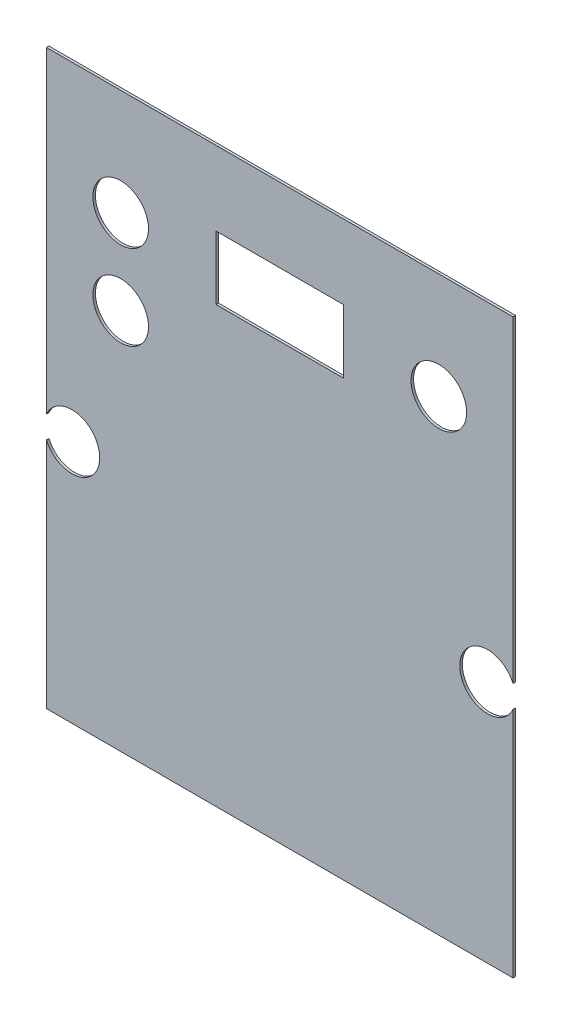
ISO-10303-21;
HEADER;
FILE_DESCRIPTION(('STEP AP214'),'2;1');
FILE_NAME('part.step','',(''),(''),'','','');
FILE_SCHEMA(('AUTOMOTIVE_DESIGN { 1 0 10303 214 1 1 1 1 }'));
ENDSEC;
DATA;
#1=APPLICATION_CONTEXT('core data for automotive mechanical design processes');
#2=APPLICATION_PROTOCOL_DEFINITION('international standard','automotive_design',2000,#1);
#3=PRODUCT_CONTEXT('',#1,'mechanical');
#4=PRODUCT('Part','Part','',(#3));
#5=PRODUCT_RELATED_PRODUCT_CATEGORY('part','',(#4));
#6=PRODUCT_DEFINITION_FORMATION('','',#4);
#7=PRODUCT_DEFINITION_CONTEXT('part definition',#1,'design');
#8=PRODUCT_DEFINITION('design','',#6,#7);
#9=PRODUCT_DEFINITION_SHAPE('','',#8);
#10=(LENGTH_UNIT() NAMED_UNIT(*) SI_UNIT(.MILLI.,.METRE.));
#11=(NAMED_UNIT(*) PLANE_ANGLE_UNIT() SI_UNIT($,.RADIAN.));
#12=(NAMED_UNIT(*) SI_UNIT($,.STERADIAN.) SOLID_ANGLE_UNIT());
#13=UNCERTAINTY_MEASURE_WITH_UNIT(LENGTH_MEASURE(1.E-05),#10,'distance_accuracy_value','');
#14=(GEOMETRIC_REPRESENTATION_CONTEXT(3) GLOBAL_UNCERTAINTY_ASSIGNED_CONTEXT((#13)) GLOBAL_UNIT_ASSIGNED_CONTEXT((#10,
#11,#12)) REPRESENTATION_CONTEXT('',''));
#15=CARTESIAN_POINT('',(0.,0.,0.));
#16=DIRECTION('',(0.,0.,1.));
#17=DIRECTION('',(1.,0.,0.));
#18=AXIS2_PLACEMENT_3D('',#15,#16,#17);
#19=CARTESIAN_POINT('',(26.416,14.605,0.15));
#20=DIRECTION('',(0.,0.,1.));
#21=DIRECTION('',(1.,0.,0.));
#22=AXIS2_PLACEMENT_3D('',#19,#20,#21);
#23=PLANE('',#22);
#24=CARTESIAN_POINT('',(4.445,27.94,0.15));
#25=DIRECTION('',(0.,0.,1.));
#26=DIRECTION('',(1.,0.,0.));
#27=AXIS2_PLACEMENT_3D('',#24,#25,#26);
#28=CIRCLE('',#27,1.6637);
#29=CARTESIAN_POINT('',(6.1087,27.94,0.15));
#30=VERTEX_POINT('',#29);
#31=EDGE_CURVE('E164',#30,#30,#28,.T.);
#32=ORIENTED_EDGE('',*,*,#31,.F.);
#33=EDGE_LOOP('',(#32));
#34=FACE_BOUND('',#33,.T.);
#35=DIRECTION('',(0.,-1.,0.));
#36=VECTOR('',#35,1.);
#37=CARTESIAN_POINT('',(0.,13.9376757235047,0.15));
#38=LINE('',#37,#36);
#39=CARTESIAN_POINT('',(0.,13.9376757235047,0.15));
#40=VERTEX_POINT('',#39);
#41=CARTESIAN_POINT('',(0.,0.,0.15));
#42=VERTEX_POINT('',#41);
#43=EDGE_CURVE('E176',#40,#42,#38,.T.);
#44=ORIENTED_EDGE('',*,*,#43,.T.);
#45=DIRECTION('',(1.,0.,0.));
#46=VECTOR('',#45,1.);
#47=CARTESIAN_POINT('',(0.,0.,0.15));
#48=LINE('',#47,#46);
#49=CARTESIAN_POINT('',(27.94,0.,0.15));
#50=VERTEX_POINT('',#49);
#51=EDGE_CURVE('E179',#42,#50,#48,.T.);
#52=ORIENTED_EDGE('',*,*,#51,.T.);
#53=DIRECTION('',(0.,1.,0.));
#54=VECTOR('',#53,1.);
#55=CARTESIAN_POINT('',(27.94,0.,0.15));
#56=LINE('',#55,#54);
#57=CARTESIAN_POINT('',(27.94,13.9376757235047,0.15));
#58=VERTEX_POINT('',#57);
#59=EDGE_CURVE('E182',#50,#58,#56,.T.);
#60=ORIENTED_EDGE('',*,*,#59,.T.);
#61=CARTESIAN_POINT('',(26.416,14.605,0.15));
#62=DIRECTION('',(0.,0.,-1.));
#63=DIRECTION('',(1.,0.,0.));
#64=AXIS2_PLACEMENT_3D('',#61,#62,#63);
#65=CIRCLE('',#64,1.6637);
#66=CARTESIAN_POINT('',(27.94,15.2723242764953,0.15));
#67=VERTEX_POINT('',#66);
#68=EDGE_CURVE('E184',#58,#67,#65,.T.);
#69=ORIENTED_EDGE('',*,*,#68,.T.);
#70=DIRECTION('',(0.,1.,0.));
#71=VECTOR('',#70,1.);
#72=CARTESIAN_POINT('',(27.94,15.2723242764953,0.15));
#73=LINE('',#72,#71);
#74=CARTESIAN_POINT('',(27.94,34.29,0.15));
#75=VERTEX_POINT('',#74);
#76=EDGE_CURVE('E186',#67,#75,#73,.T.);
#77=ORIENTED_EDGE('',*,*,#76,.T.);
#78=DIRECTION('',(-1.,0.,0.));
#79=VECTOR('',#78,1.);
#80=CARTESIAN_POINT('',(27.94,34.29,0.15));
#81=LINE('',#80,#79);
#82=CARTESIAN_POINT('',(0.,34.29,0.15));
#83=VERTEX_POINT('',#82);
#84=EDGE_CURVE('E188',#75,#83,#81,.T.);
#85=ORIENTED_EDGE('',*,*,#84,.T.);
#86=DIRECTION('',(0.,-1.,0.));
#87=VECTOR('',#86,1.);
#88=CARTESIAN_POINT('',(0.,34.29,0.15));
#89=LINE('',#88,#87);
#90=CARTESIAN_POINT('',(0.,15.2723242764953,0.15));
#91=VERTEX_POINT('',#90);
#92=EDGE_CURVE('E190',#83,#91,#89,.T.);
#93=ORIENTED_EDGE('',*,*,#92,.T.);
#94=CARTESIAN_POINT('',(1.524,14.605,0.15));
#95=DIRECTION('',(0.,0.,-1.));
#96=DIRECTION('',(1.,0.,0.));
#97=AXIS2_PLACEMENT_3D('',#94,#95,#96);
#98=CIRCLE('',#97,1.6637);
#99=EDGE_CURVE('E192',#91,#40,#98,.T.);
#100=ORIENTED_EDGE('',*,*,#99,.T.);
#101=EDGE_LOOP('',(#44,#52,#60,#69,#77,#85,#93,#100));
#102=FACE_BOUND('',#101,.T.);
#103=CARTESIAN_POINT('',(4.445,22.86,0.15));
#104=DIRECTION('',(0.,0.,1.));
#105=DIRECTION('',(1.,0.,0.));
#106=AXIS2_PLACEMENT_3D('',#103,#104,#105);
#107=CIRCLE('',#106,1.6637);
#108=CARTESIAN_POINT('',(6.1087,22.86,0.15));
#109=VERTEX_POINT('',#108);
#110=EDGE_CURVE('E170',#109,#109,#107,.T.);
#111=ORIENTED_EDGE('',*,*,#110,.F.);
#112=EDGE_LOOP('',(#111));
#113=FACE_BOUND('',#112,.T.);
#114=CARTESIAN_POINT('',(23.495,27.94,0.15));
#115=DIRECTION('',(0.,0.,1.));
#116=DIRECTION('',(1.,0.,0.));
#117=AXIS2_PLACEMENT_3D('',#114,#115,#116);
#118=CIRCLE('',#117,1.6637);
#119=CARTESIAN_POINT('',(25.1587,27.94,0.15));
#120=VERTEX_POINT('',#119);
#121=EDGE_CURVE('E158',#120,#120,#118,.T.);
#122=ORIENTED_EDGE('',*,*,#121,.F.);
#123=EDGE_LOOP('',(#122));
#124=FACE_BOUND('',#123,.T.);
#125=DIRECTION('',(-1.,0.,0.));
#126=VECTOR('',#125,1.);
#127=CARTESIAN_POINT('',(10.16,29.845,0.15));
#128=LINE('',#127,#126);
#129=CARTESIAN_POINT('',(17.78,29.845,0.15));
#130=VERTEX_POINT('',#129);
#131=CARTESIAN_POINT('',(10.16,29.845,0.15));
#132=VERTEX_POINT('',#131);
#133=EDGE_CURVE('E130',#130,#132,#128,.T.);
#134=ORIENTED_EDGE('',*,*,#133,.F.);
#135=DIRECTION('',(0.,1.,0.));
#136=VECTOR('',#135,1.);
#137=CARTESIAN_POINT('',(17.78,26.035,0.15));
#138=LINE('',#137,#136);
#139=CARTESIAN_POINT('',(17.78,26.035,0.15));
#140=VERTEX_POINT('',#139);
#141=EDGE_CURVE('E122',#140,#130,#138,.T.);
#142=ORIENTED_EDGE('',*,*,#141,.F.);
#143=DIRECTION('',(1.,0.,0.));
#144=VECTOR('',#143,1.);
#145=CARTESIAN_POINT('',(10.16,26.035,0.15));
#146=LINE('',#145,#144);
#147=CARTESIAN_POINT('',(10.16,26.035,0.15));
#148=VERTEX_POINT('',#147);
#149=EDGE_CURVE('E144',#148,#140,#146,.T.);
#150=ORIENTED_EDGE('',*,*,#149,.F.);
#151=DIRECTION('',(0.,-1.,0.));
#152=VECTOR('',#151,1.);
#153=CARTESIAN_POINT('',(10.16,26.035,0.15));
#154=LINE('',#153,#152);
#155=EDGE_CURVE('E142',#132,#148,#154,.T.);
#156=ORIENTED_EDGE('',*,*,#155,.F.);
#157=EDGE_LOOP('',(#134,#142,#150,#156));
#158=FACE_BOUND('',#157,.T.);
#159=ADVANCED_FACE('F33',(#34,#102,#113,#124,#158),#23,.T.);
#160=CARTESIAN_POINT('',(26.416,14.605,0.));
#161=DIRECTION('',(0.,0.,1.));
#162=DIRECTION('',(1.,0.,0.));
#163=AXIS2_PLACEMENT_3D('',#160,#161,#162);
#164=PLANE('',#163);
#165=CARTESIAN_POINT('',(23.495,27.94,0.));
#166=DIRECTION('',(0.,0.,1.));
#167=DIRECTION('',(1.,0.,0.));
#168=AXIS2_PLACEMENT_3D('',#165,#166,#167);
#169=CIRCLE('',#168,1.6637);
#170=CARTESIAN_POINT('',(25.1587,27.94,0.));
#171=VERTEX_POINT('',#170);
#172=EDGE_CURVE('E138',#171,#171,#169,.T.);
#173=ORIENTED_EDGE('',*,*,#172,.T.);
#174=EDGE_LOOP('',(#173));
#175=FACE_BOUND('',#174,.T.);
#176=CARTESIAN_POINT('',(4.445,27.94,0.));
#177=DIRECTION('',(0.,0.,1.));
#178=DIRECTION('',(1.,0.,0.));
#179=AXIS2_PLACEMENT_3D('',#176,#177,#178);
#180=CIRCLE('',#179,1.6637);
#181=CARTESIAN_POINT('',(6.1087,27.94,0.));
#182=VERTEX_POINT('',#181);
#183=EDGE_CURVE('E161',#182,#182,#180,.T.);
#184=ORIENTED_EDGE('',*,*,#183,.T.);
#185=EDGE_LOOP('',(#184));
#186=FACE_BOUND('',#185,.T.);
#187=CARTESIAN_POINT('',(4.445,22.86,0.));
#188=DIRECTION('',(0.,0.,1.));
#189=DIRECTION('',(1.,0.,0.));
#190=AXIS2_PLACEMENT_3D('',#187,#188,#189);
#191=CIRCLE('',#190,1.6637);
#192=CARTESIAN_POINT('',(6.1087,22.86,0.));
#193=VERTEX_POINT('',#192);
#194=EDGE_CURVE('E167',#193,#193,#191,.T.);
#195=ORIENTED_EDGE('',*,*,#194,.T.);
#196=EDGE_LOOP('',(#195));
#197=FACE_BOUND('',#196,.T.);
#198=DIRECTION('',(0.,-1.,0.));
#199=VECTOR('',#198,1.);
#200=CARTESIAN_POINT('',(0.,13.9376757235047,0.));
#201=LINE('',#200,#199);
#202=CARTESIAN_POINT('',(0.,13.9376757235047,0.));
#203=VERTEX_POINT('',#202);
#204=CARTESIAN_POINT('',(0.,0.,0.));
#205=VERTEX_POINT('',#204);
#206=EDGE_CURVE('E173',#203,#205,#201,.T.);
#207=ORIENTED_EDGE('',*,*,#206,.F.);
#208=CARTESIAN_POINT('',(1.524,14.605,0.));
#209=DIRECTION('',(0.,0.,-1.));
#210=DIRECTION('',(1.,0.,0.));
#211=AXIS2_PLACEMENT_3D('',#208,#209,#210);
#212=CIRCLE('',#211,1.6637);
#213=CARTESIAN_POINT('',(0.,15.2723242764953,0.));
#214=VERTEX_POINT('',#213);
#215=EDGE_CURVE('E180',#214,#203,#212,.T.);
#216=ORIENTED_EDGE('',*,*,#215,.F.);
#217=DIRECTION('',(0.,-1.,0.));
#218=VECTOR('',#217,1.);
#219=CARTESIAN_POINT('',(0.,34.29,0.));
#220=LINE('',#219,#218);
#221=CARTESIAN_POINT('',(0.,34.29,0.));
#222=VERTEX_POINT('',#221);
#223=EDGE_CURVE('E207',#222,#214,#220,.T.);
#224=ORIENTED_EDGE('',*,*,#223,.F.);
#225=DIRECTION('',(-1.,0.,0.));
#226=VECTOR('',#225,1.);
#227=CARTESIAN_POINT('',(27.94,34.29,0.));
#228=LINE('',#227,#226);
#229=CARTESIAN_POINT('',(27.94,34.29,0.));
#230=VERTEX_POINT('',#229);
#231=EDGE_CURVE('E205',#230,#222,#228,.T.);
#232=ORIENTED_EDGE('',*,*,#231,.F.);
#233=DIRECTION('',(0.,1.,0.));
#234=VECTOR('',#233,1.);
#235=CARTESIAN_POINT('',(27.94,15.2723242764953,0.));
#236=LINE('',#235,#234);
#237=CARTESIAN_POINT('',(27.94,15.2723242764953,0.));
#238=VERTEX_POINT('',#237);
#239=EDGE_CURVE('E203',#238,#230,#236,.T.);
#240=ORIENTED_EDGE('',*,*,#239,.F.);
#241=CARTESIAN_POINT('',(26.416,14.605,0.));
#242=DIRECTION('',(0.,0.,-1.));
#243=DIRECTION('',(1.,0.,0.));
#244=AXIS2_PLACEMENT_3D('',#241,#242,#243);
#245=CIRCLE('',#244,1.6637);
#246=CARTESIAN_POINT('',(27.94,13.9376757235047,0.));
#247=VERTEX_POINT('',#246);
#248=EDGE_CURVE('E201',#247,#238,#245,.T.);
#249=ORIENTED_EDGE('',*,*,#248,.F.);
#250=DIRECTION('',(0.,1.,0.));
#251=VECTOR('',#250,1.);
#252=CARTESIAN_POINT('',(27.94,0.,0.));
#253=LINE('',#252,#251);
#254=CARTESIAN_POINT('',(27.94,0.,0.));
#255=VERTEX_POINT('',#254);
#256=EDGE_CURVE('E199',#255,#247,#253,.T.);
#257=ORIENTED_EDGE('',*,*,#256,.F.);
#258=DIRECTION('',(1.,0.,0.));
#259=VECTOR('',#258,1.);
#260=CARTESIAN_POINT('',(0.,0.,0.));
#261=LINE('',#260,#259);
#262=EDGE_CURVE('E197',#205,#255,#261,.T.);
#263=ORIENTED_EDGE('',*,*,#262,.F.);
#264=EDGE_LOOP('',(#207,#216,#224,#232,#240,#249,#257,#263));
#265=FACE_BOUND('',#264,.T.);
#266=DIRECTION('',(0.,1.,0.));
#267=VECTOR('',#266,1.);
#268=CARTESIAN_POINT('',(17.78,26.035,0.));
#269=LINE('',#268,#267);
#270=CARTESIAN_POINT('',(17.78,26.035,0.));
#271=VERTEX_POINT('',#270);
#272=CARTESIAN_POINT('',(17.78,29.845,0.));
#273=VERTEX_POINT('',#272);
#274=EDGE_CURVE('E56',#271,#273,#269,.T.);
#275=ORIENTED_EDGE('',*,*,#274,.T.);
#276=DIRECTION('',(-1.,0.,0.));
#277=VECTOR('',#276,1.);
#278=CARTESIAN_POINT('',(10.16,29.845,0.));
#279=LINE('',#278,#277);
#280=CARTESIAN_POINT('',(10.16,29.845,0.));
#281=VERTEX_POINT('',#280);
#282=EDGE_CURVE('E137',#273,#281,#279,.T.);
#283=ORIENTED_EDGE('',*,*,#282,.T.);
#284=DIRECTION('',(0.,-1.,0.));
#285=VECTOR('',#284,1.);
#286=CARTESIAN_POINT('',(10.16,26.035,0.));
#287=LINE('',#286,#285);
#288=CARTESIAN_POINT('',(10.16,26.035,0.));
#289=VERTEX_POINT('',#288);
#290=EDGE_CURVE('E150',#281,#289,#287,.T.);
#291=ORIENTED_EDGE('',*,*,#290,.T.);
#292=DIRECTION('',(1.,0.,0.));
#293=VECTOR('',#292,1.);
#294=CARTESIAN_POINT('',(10.16,26.035,0.));
#295=LINE('',#294,#293);
#296=EDGE_CURVE('E131',#289,#271,#295,.T.);
#297=ORIENTED_EDGE('',*,*,#296,.T.);
#298=EDGE_LOOP('',(#275,#283,#291,#297));
#299=FACE_BOUND('',#298,.T.);
#300=ADVANCED_FACE('F237',(#175,#186,#197,#265,#299),#164,.F.);
#301=CARTESIAN_POINT('',(0.,13.9376757235047,0.15));
#302=DIRECTION('',(1.,0.,0.));
#303=DIRECTION('',(0.,0.,-1.));
#304=AXIS2_PLACEMENT_3D('',#301,#302,#303);
#305=PLANE('',#304);
#306=ORIENTED_EDGE('',*,*,#206,.T.);
#307=DIRECTION('',(0.,0.,-1.));
#308=VECTOR('',#307,1.);
#309=CARTESIAN_POINT('',(0.,0.,0.15));
#310=LINE('',#309,#308);
#311=EDGE_CURVE('E11',#42,#205,#310,.T.);
#312=ORIENTED_EDGE('',*,*,#311,.F.);
#313=ORIENTED_EDGE('',*,*,#43,.F.);
#314=DIRECTION('',(0.,0.,-1.));
#315=VECTOR('',#314,1.);
#316=CARTESIAN_POINT('',(0.,13.9376757235047,0.15));
#317=LINE('',#316,#315);
#318=EDGE_CURVE('E194',#40,#203,#317,.T.);
#319=ORIENTED_EDGE('',*,*,#318,.T.);
#320=EDGE_LOOP('',(#306,#312,#313,#319));
#321=FACE_BOUND('',#320,.T.);
#322=ADVANCED_FACE('F35',(#321),#305,.F.);
#323=CARTESIAN_POINT('',(0.,0.,0.15));
#324=DIRECTION('',(0.,1.,0.));
#325=DIRECTION('',(-1.,0.,0.));
#326=AXIS2_PLACEMENT_3D('',#323,#324,#325);
#327=PLANE('',#326);
#328=ORIENTED_EDGE('',*,*,#262,.T.);
#329=DIRECTION('',(0.,0.,-1.));
#330=VECTOR('',#329,1.);
#331=CARTESIAN_POINT('',(27.94,0.,0.15));
#332=LINE('',#331,#330);
#333=EDGE_CURVE('E41',#50,#255,#332,.T.);
#334=ORIENTED_EDGE('',*,*,#333,.F.);
#335=ORIENTED_EDGE('',*,*,#51,.F.);
#336=ORIENTED_EDGE('',*,*,#311,.T.);
#337=EDGE_LOOP('',(#328,#334,#335,#336));
#338=FACE_BOUND('',#337,.T.);
#339=ADVANCED_FACE('F255',(#338),#327,.F.);
#340=CARTESIAN_POINT('',(27.94,0.,0.15));
#341=DIRECTION('',(-1.,0.,0.));
#342=DIRECTION('',(0.,0.,1.));
#343=AXIS2_PLACEMENT_3D('',#340,#341,#342);
#344=PLANE('',#343);
#345=ORIENTED_EDGE('',*,*,#256,.T.);
#346=DIRECTION('',(0.,0.,-1.));
#347=VECTOR('',#346,1.);
#348=CARTESIAN_POINT('',(27.94,13.9376757235047,0.15));
#349=LINE('',#348,#347);
#350=EDGE_CURVE('E224',#58,#247,#349,.T.);
#351=ORIENTED_EDGE('',*,*,#350,.F.);
#352=ORIENTED_EDGE('',*,*,#59,.F.);
#353=ORIENTED_EDGE('',*,*,#333,.T.);
#354=EDGE_LOOP('',(#345,#351,#352,#353));
#355=FACE_BOUND('',#354,.T.);
#356=ADVANCED_FACE('F231',(#355),#344,.F.);
#357=CARTESIAN_POINT('',(26.416,14.605,0.15));
#358=DIRECTION('',(0.,0.,-1.));
#359=DIRECTION('',(-1.,0.,0.));
#360=AXIS2_PLACEMENT_3D('',#357,#358,#359);
#361=CYLINDRICAL_SURFACE('',#360,1.6637);
#362=ORIENTED_EDGE('',*,*,#248,.T.);
#363=DIRECTION('',(0.,0.,-1.));
#364=VECTOR('',#363,1.);
#365=CARTESIAN_POINT('',(27.94,15.2723242764953,0.15));
#366=LINE('',#365,#364);
#367=EDGE_CURVE('E221',#67,#238,#366,.T.);
#368=ORIENTED_EDGE('',*,*,#367,.F.);
#369=ORIENTED_EDGE('',*,*,#68,.F.);
#370=ORIENTED_EDGE('',*,*,#350,.T.);
#371=EDGE_LOOP('',(#362,#368,#369,#370));
#372=FACE_BOUND('',#371,.T.);
#373=ADVANCED_FACE('F243',(#372),#361,.F.);
#374=CARTESIAN_POINT('',(27.94,15.2723242764953,0.15));
#375=DIRECTION('',(-1.,0.,0.));
#376=DIRECTION('',(0.,0.,1.));
#377=AXIS2_PLACEMENT_3D('',#374,#375,#376);
#378=PLANE('',#377);
#379=ORIENTED_EDGE('',*,*,#239,.T.);
#380=DIRECTION('',(0.,0.,-1.));
#381=VECTOR('',#380,1.);
#382=CARTESIAN_POINT('',(27.94,34.29,0.15));
#383=LINE('',#382,#381);
#384=EDGE_CURVE('E218',#75,#230,#383,.T.);
#385=ORIENTED_EDGE('',*,*,#384,.F.);
#386=ORIENTED_EDGE('',*,*,#76,.F.);
#387=ORIENTED_EDGE('',*,*,#367,.T.);
#388=EDGE_LOOP('',(#379,#385,#386,#387));
#389=FACE_BOUND('',#388,.T.);
#390=ADVANCED_FACE('F247',(#389),#378,.F.);
#391=CARTESIAN_POINT('',(27.94,34.29,0.15));
#392=DIRECTION('',(0.,-1.,0.));
#393=DIRECTION('',(0.,0.,-1.));
#394=AXIS2_PLACEMENT_3D('',#391,#392,#393);
#395=PLANE('',#394);
#396=ORIENTED_EDGE('',*,*,#231,.T.);
#397=DIRECTION('',(0.,0.,-1.));
#398=VECTOR('',#397,1.);
#399=CARTESIAN_POINT('',(0.,34.29,0.15));
#400=LINE('',#399,#398);
#401=EDGE_CURVE('E215',#83,#222,#400,.T.);
#402=ORIENTED_EDGE('',*,*,#401,.F.);
#403=ORIENTED_EDGE('',*,*,#84,.F.);
#404=ORIENTED_EDGE('',*,*,#384,.T.);
#405=EDGE_LOOP('',(#396,#402,#403,#404));
#406=FACE_BOUND('',#405,.T.);
#407=ADVANCED_FACE('F268',(#406),#395,.F.);
#408=CARTESIAN_POINT('',(0.,34.29,0.15));
#409=DIRECTION('',(1.,0.,0.));
#410=DIRECTION('',(0.,0.,-1.));
#411=AXIS2_PLACEMENT_3D('',#408,#409,#410);
#412=PLANE('',#411);
#413=ORIENTED_EDGE('',*,*,#223,.T.);
#414=DIRECTION('',(0.,0.,-1.));
#415=VECTOR('',#414,1.);
#416=CARTESIAN_POINT('',(0.,15.2723242764953,0.15));
#417=LINE('',#416,#415);
#418=EDGE_CURVE('E212',#91,#214,#417,.T.);
#419=ORIENTED_EDGE('',*,*,#418,.F.);
#420=ORIENTED_EDGE('',*,*,#92,.F.);
#421=ORIENTED_EDGE('',*,*,#401,.T.);
#422=EDGE_LOOP('',(#413,#419,#420,#421));
#423=FACE_BOUND('',#422,.T.);
#424=ADVANCED_FACE('F266',(#423),#412,.F.);
#425=CARTESIAN_POINT('',(1.524,14.605,0.15));
#426=DIRECTION('',(0.,0.,-1.));
#427=DIRECTION('',(-1.,0.,0.));
#428=AXIS2_PLACEMENT_3D('',#425,#426,#427);
#429=CYLINDRICAL_SURFACE('',#428,1.6637);
#430=ORIENTED_EDGE('',*,*,#215,.T.);
#431=ORIENTED_EDGE('',*,*,#318,.F.);
#432=ORIENTED_EDGE('',*,*,#99,.F.);
#433=ORIENTED_EDGE('',*,*,#418,.T.);
#434=EDGE_LOOP('',(#430,#431,#432,#433));
#435=FACE_BOUND('',#434,.T.);
#436=ADVANCED_FACE('F261',(#435),#429,.F.);
#437=CARTESIAN_POINT('',(4.445,22.86,0.15));
#438=DIRECTION('',(0.,0.,-1.));
#439=DIRECTION('',(-1.,0.,0.));
#440=AXIS2_PLACEMENT_3D('',#437,#438,#439);
#441=CYLINDRICAL_SURFACE('',#440,1.6637);
#442=ORIENTED_EDGE('',*,*,#110,.T.);
#443=EDGE_LOOP('',(#442));
#444=FACE_BOUND('',#443,.T.);
#445=ORIENTED_EDGE('',*,*,#194,.F.);
#446=EDGE_LOOP('',(#445));
#447=FACE_BOUND('',#446,.T.);
#448=ADVANCED_FACE('F287',(#444,#447),#441,.F.);
#449=CARTESIAN_POINT('',(4.445,27.94,0.15));
#450=DIRECTION('',(0.,0.,-1.));
#451=DIRECTION('',(-1.,0.,0.));
#452=AXIS2_PLACEMENT_3D('',#449,#450,#451);
#453=CYLINDRICAL_SURFACE('',#452,1.6637);
#454=ORIENTED_EDGE('',*,*,#31,.T.);
#455=EDGE_LOOP('',(#454));
#456=FACE_BOUND('',#455,.T.);
#457=ORIENTED_EDGE('',*,*,#183,.F.);
#458=EDGE_LOOP('',(#457));
#459=FACE_BOUND('',#458,.T.);
#460=ADVANCED_FACE('F294',(#456,#459),#453,.F.);
#461=CARTESIAN_POINT('',(23.495,27.94,0.15));
#462=DIRECTION('',(0.,0.,-1.));
#463=DIRECTION('',(-1.,0.,0.));
#464=AXIS2_PLACEMENT_3D('',#461,#462,#463);
#465=CYLINDRICAL_SURFACE('',#464,1.6637);
#466=ORIENTED_EDGE('',*,*,#121,.T.);
#467=EDGE_LOOP('',(#466));
#468=FACE_BOUND('',#467,.T.);
#469=ORIENTED_EDGE('',*,*,#172,.F.);
#470=EDGE_LOOP('',(#469));
#471=FACE_BOUND('',#470,.T.);
#472=ADVANCED_FACE('F299',(#468,#471),#465,.F.);
#473=CARTESIAN_POINT('',(17.78,26.035,0.15));
#474=DIRECTION('',(-1.,0.,0.));
#475=DIRECTION('',(0.,0.,1.));
#476=AXIS2_PLACEMENT_3D('',#473,#474,#475);
#477=PLANE('',#476);
#478=ORIENTED_EDGE('',*,*,#274,.F.);
#479=DIRECTION('',(0.,0.,-1.));
#480=VECTOR('',#479,1.);
#481=CARTESIAN_POINT('',(17.78,26.035,0.15));
#482=LINE('',#481,#480);
#483=EDGE_CURVE('E126',#140,#271,#482,.T.);
#484=ORIENTED_EDGE('',*,*,#483,.F.);
#485=ORIENTED_EDGE('',*,*,#141,.T.);
#486=DIRECTION('',(0.,0.,-1.));
#487=VECTOR('',#486,1.);
#488=CARTESIAN_POINT('',(17.78,29.845,0.15));
#489=LINE('',#488,#487);
#490=EDGE_CURVE('E125',#130,#273,#489,.T.);
#491=ORIENTED_EDGE('',*,*,#490,.T.);
#492=EDGE_LOOP('',(#478,#484,#485,#491));
#493=FACE_BOUND('',#492,.T.);
#494=ADVANCED_FACE('F124',(#493),#477,.T.);
#495=CARTESIAN_POINT('',(10.16,29.845,0.15));
#496=DIRECTION('',(0.,-1.,0.));
#497=DIRECTION('',(0.,0.,-1.));
#498=AXIS2_PLACEMENT_3D('',#495,#496,#497);
#499=PLANE('',#498);
#500=ORIENTED_EDGE('',*,*,#282,.F.);
#501=ORIENTED_EDGE('',*,*,#490,.F.);
#502=ORIENTED_EDGE('',*,*,#133,.T.);
#503=DIRECTION('',(0.,0.,-1.));
#504=VECTOR('',#503,1.);
#505=CARTESIAN_POINT('',(10.16,29.845,0.15));
#506=LINE('',#505,#504);
#507=EDGE_CURVE('E139',#132,#281,#506,.T.);
#508=ORIENTED_EDGE('',*,*,#507,.T.);
#509=EDGE_LOOP('',(#500,#501,#502,#508));
#510=FACE_BOUND('',#509,.T.);
#511=ADVANCED_FACE('F134',(#510),#499,.T.);
#512=CARTESIAN_POINT('',(10.16,26.035,0.15));
#513=DIRECTION('',(1.,0.,0.));
#514=DIRECTION('',(0.,0.,-1.));
#515=AXIS2_PLACEMENT_3D('',#512,#513,#514);
#516=PLANE('',#515);
#517=ORIENTED_EDGE('',*,*,#290,.F.);
#518=ORIENTED_EDGE('',*,*,#507,.F.);
#519=ORIENTED_EDGE('',*,*,#155,.T.);
#520=DIRECTION('',(0.,0.,-1.));
#521=VECTOR('',#520,1.);
#522=CARTESIAN_POINT('',(10.16,26.035,0.15));
#523=LINE('',#522,#521);
#524=EDGE_CURVE('E48',#148,#289,#523,.T.);
#525=ORIENTED_EDGE('',*,*,#524,.T.);
#526=EDGE_LOOP('',(#517,#518,#519,#525));
#527=FACE_BOUND('',#526,.T.);
#528=ADVANCED_FACE('F322',(#527),#516,.T.);
#529=CARTESIAN_POINT('',(10.16,26.035,0.15));
#530=DIRECTION('',(0.,1.,0.));
#531=DIRECTION('',(0.,0.,1.));
#532=AXIS2_PLACEMENT_3D('',#529,#530,#531);
#533=PLANE('',#532);
#534=ORIENTED_EDGE('',*,*,#296,.F.);
#535=ORIENTED_EDGE('',*,*,#524,.F.);
#536=ORIENTED_EDGE('',*,*,#149,.T.);
#537=ORIENTED_EDGE('',*,*,#483,.T.);
#538=EDGE_LOOP('',(#534,#535,#536,#537));
#539=FACE_BOUND('',#538,.T.);
#540=ADVANCED_FACE('F325',(#539),#533,.T.);
#541=CLOSED_SHELL('',(#159,#300,#322,#339,#356,#373,#390,#407,#424,#436,#448,#460,#472,#494,
#511,#528,#540));
#542=MANIFOLD_SOLID_BREP('B2',#541);
#543=ADVANCED_BREP_SHAPE_REPRESENTATION('',(#18,#542),#14);
#544=SHAPE_DEFINITION_REPRESENTATION(#9,#543);
ENDSEC;
END-ISO-10303-21;
